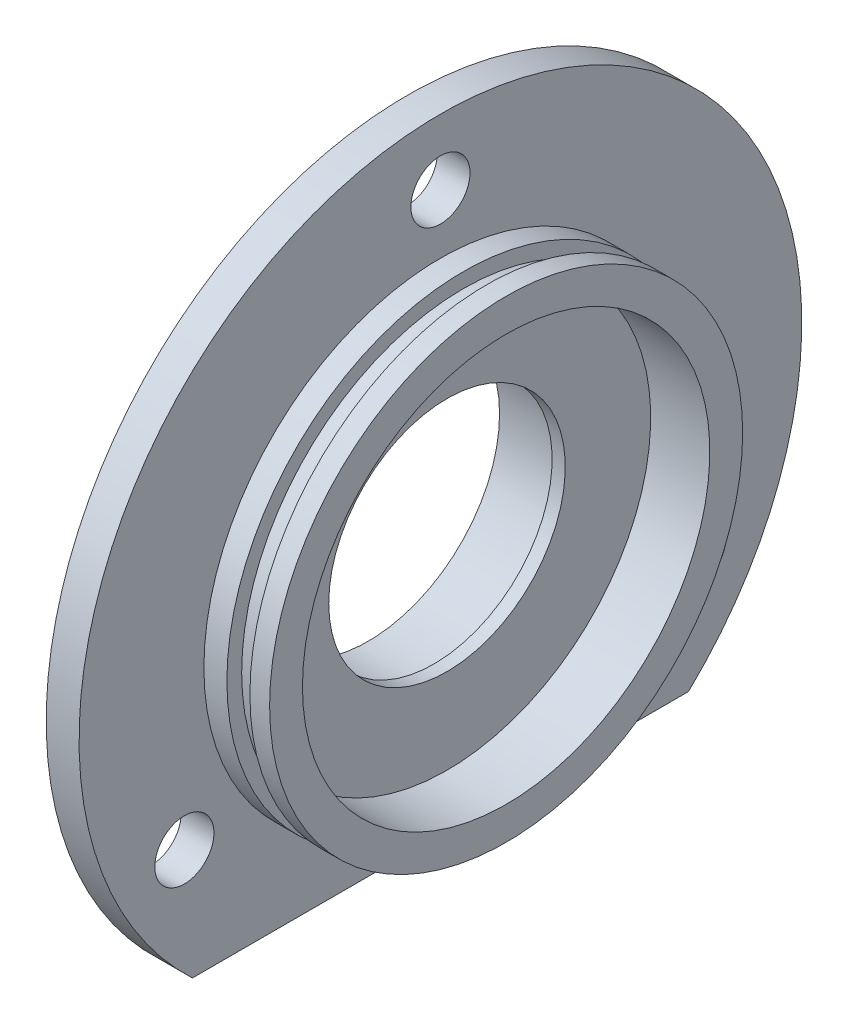
ISO-10303-21;
HEADER;
FILE_DESCRIPTION(('STEP AP214'),'2;1');
FILE_NAME('part.step','',(''),(''),'','','');
FILE_SCHEMA(('AUTOMOTIVE_DESIGN { 1 0 10303 214 1 1 1 1 }'));
ENDSEC;
DATA;
#1=APPLICATION_CONTEXT('core data for automotive mechanical design processes');
#2=APPLICATION_PROTOCOL_DEFINITION('international standard','automotive_design',2000,#1);
#3=PRODUCT_CONTEXT('',#1,'mechanical');
#4=PRODUCT('Part','Part','',(#3));
#5=PRODUCT_RELATED_PRODUCT_CATEGORY('part','',(#4));
#6=PRODUCT_DEFINITION_FORMATION('','',#4);
#7=PRODUCT_DEFINITION_CONTEXT('part definition',#1,'design');
#8=PRODUCT_DEFINITION('design','',#6,#7);
#9=PRODUCT_DEFINITION_SHAPE('','',#8);
#10=(LENGTH_UNIT() NAMED_UNIT(*) SI_UNIT(.MILLI.,.METRE.));
#11=(NAMED_UNIT(*) PLANE_ANGLE_UNIT() SI_UNIT($,.RADIAN.));
#12=(NAMED_UNIT(*) SI_UNIT($,.STERADIAN.) SOLID_ANGLE_UNIT());
#13=UNCERTAINTY_MEASURE_WITH_UNIT(LENGTH_MEASURE(1.E-05),#10,'distance_accuracy_value','');
#14=(GEOMETRIC_REPRESENTATION_CONTEXT(3) GLOBAL_UNCERTAINTY_ASSIGNED_CONTEXT((#13)) GLOBAL_UNIT_ASSIGNED_CONTEXT((#10,
#11,#12)) REPRESENTATION_CONTEXT('',''));
#15=CARTESIAN_POINT('',(0.,0.,0.));
#16=DIRECTION('',(0.,0.,1.));
#17=DIRECTION('',(1.,0.,0.));
#18=AXIS2_PLACEMENT_3D('',#15,#16,#17);
#19=CARTESIAN_POINT('',(-8.30675957445903,-20.,0.));
#20=DIRECTION('',(-1.,0.,0.));
#21=DIRECTION('',(0.,0.,1.));
#22=AXIS2_PLACEMENT_3D('',#19,#20,#21);
#23=CYLINDRICAL_SURFACE('',#22,25.);
#24=CARTESIAN_POINT('',(0.,-20.,0.));
#25=DIRECTION('',(-1.,0.,0.));
#26=DIRECTION('',(0.,0.,1.));
#27=AXIS2_PLACEMENT_3D('',#24,#25,#26);
#28=CIRCLE('',#27,25.);
#29=CARTESIAN_POINT('',(0.,-20.,25.));
#30=VERTEX_POINT('',#29);
#31=EDGE_CURVE('E11',#30,#30,#28,.T.);
#32=ORIENTED_EDGE('',*,*,#31,.F.);
#33=EDGE_LOOP('',(#32));
#34=FACE_BOUND('',#33,.T.);
#35=CARTESIAN_POINT('',(6.,-20.,0.));
#36=DIRECTION('',(-1.,0.,0.));
#37=DIRECTION('',(0.,0.,1.));
#38=AXIS2_PLACEMENT_3D('',#35,#36,#37);
#39=CIRCLE('',#38,25.);
#40=CARTESIAN_POINT('',(6.,-20.,25.));
#41=VERTEX_POINT('',#40);
#42=EDGE_CURVE('E84',#41,#41,#39,.T.);
#43=ORIENTED_EDGE('',*,*,#42,.T.);
#44=EDGE_LOOP('',(#43));
#45=FACE_BOUND('',#44,.T.);
#46=ADVANCED_FACE('F39',(#34,#45),#23,.T.);
#47=CARTESIAN_POINT('',(0.,0.,0.));
#48=DIRECTION('',(1.,0.,0.));
#49=DIRECTION('',(0.,0.,-1.));
#50=AXIS2_PLACEMENT_3D('',#47,#48,#49);
#51=PLANE('',#50);
#52=CARTESIAN_POINT('',(0.,-20.,0.));
#53=DIRECTION('',(-1.,0.,0.));
#54=DIRECTION('',(0.,0.,1.));
#55=AXIS2_PLACEMENT_3D('',#52,#53,#54);
#56=CIRCLE('',#55,20.);
#57=CARTESIAN_POINT('',(0.,-20.,20.));
#58=VERTEX_POINT('',#57);
#59=EDGE_CURVE('E48',#58,#58,#56,.T.);
#60=ORIENTED_EDGE('',*,*,#59,.F.);
#61=EDGE_LOOP('',(#60));
#62=FACE_BOUND('',#61,.T.);
#63=ORIENTED_EDGE('',*,*,#31,.T.);
#64=EDGE_LOOP('',(#63));
#65=FACE_BOUND('',#64,.T.);
#66=ADVANCED_FACE('F169',(#62,#65),#51,.F.);
#67=CARTESIAN_POINT('',(-8.30675957445903,-20.,0.));
#68=DIRECTION('',(-1.,0.,0.));
#69=DIRECTION('',(0.,0.,1.));
#70=AXIS2_PLACEMENT_3D('',#67,#68,#69);
#71=CYLINDRICAL_SURFACE('',#70,20.);
#72=CARTESIAN_POINT('',(10.,-20.,0.));
#73=DIRECTION('',(-1.,0.,0.));
#74=DIRECTION('',(0.,0.,1.));
#75=AXIS2_PLACEMENT_3D('',#72,#73,#74);
#76=CIRCLE('',#75,20.);
#77=CARTESIAN_POINT('',(10.,-20.,20.));
#78=VERTEX_POINT('',#77);
#79=EDGE_CURVE('E133',#78,#78,#76,.T.);
#80=ORIENTED_EDGE('',*,*,#79,.F.);
#81=EDGE_LOOP('',(#80));
#82=FACE_BOUND('',#81,.T.);
#83=ORIENTED_EDGE('',*,*,#59,.T.);
#84=EDGE_LOOP('',(#83));
#85=FACE_BOUND('',#84,.T.);
#86=ADVANCED_FACE('F174',(#82,#85),#71,.F.);
#87=CARTESIAN_POINT('',(10.,-2.00000000000001,0.));
#88=DIRECTION('',(1.,0.,0.));
#89=DIRECTION('',(0.,0.,-1.));
#90=AXIS2_PLACEMENT_3D('',#87,#88,#89);
#91=PLANE('',#90);
#92=CARTESIAN_POINT('',(10.,-20.,0.));
#93=DIRECTION('',(-1.,0.,0.));
#94=DIRECTION('',(0.,0.,1.));
#95=AXIS2_PLACEMENT_3D('',#92,#93,#94);
#96=CIRCLE('',#95,18.);
#97=CARTESIAN_POINT('',(10.,-20.,18.));
#98=VERTEX_POINT('',#97);
#99=EDGE_CURVE('E129',#98,#98,#96,.T.);
#100=ORIENTED_EDGE('',*,*,#99,.F.);
#101=EDGE_LOOP('',(#100));
#102=FACE_BOUND('',#101,.T.);
#103=ORIENTED_EDGE('',*,*,#79,.T.);
#104=EDGE_LOOP('',(#103));
#105=FACE_BOUND('',#104,.T.);
#106=ADVANCED_FACE('F229',(#102,#105),#91,.F.);
#107=CARTESIAN_POINT('',(-8.30675957445903,-20.,0.));
#108=DIRECTION('',(-1.,0.,0.));
#109=DIRECTION('',(0.,0.,1.));
#110=AXIS2_PLACEMENT_3D('',#107,#108,#109);
#111=CYLINDRICAL_SURFACE('',#110,18.);
#112=CARTESIAN_POINT('',(12.,-20.,0.));
#113=DIRECTION('',(-1.,0.,0.));
#114=DIRECTION('',(0.,0.,1.));
#115=AXIS2_PLACEMENT_3D('',#112,#113,#114);
#116=CIRCLE('',#115,18.);
#117=CARTESIAN_POINT('',(12.,-20.,18.));
#118=VERTEX_POINT('',#117);
#119=EDGE_CURVE('E125',#118,#118,#116,.T.);
#120=ORIENTED_EDGE('',*,*,#119,.F.);
#121=EDGE_LOOP('',(#120));
#122=FACE_BOUND('',#121,.T.);
#123=ORIENTED_EDGE('',*,*,#99,.T.);
#124=EDGE_LOOP('',(#123));
#125=FACE_BOUND('',#124,.T.);
#126=ADVANCED_FACE('F225',(#122,#125),#111,.F.);
#127=CARTESIAN_POINT('',(12.,11.,0.));
#128=DIRECTION('',(-1.,0.,0.));
#129=DIRECTION('',(0.,0.,1.));
#130=AXIS2_PLACEMENT_3D('',#127,#128,#129);
#131=PLANE('',#130);
#132=CARTESIAN_POINT('',(12.,-20.,0.));
#133=DIRECTION('',(-1.,0.,0.));
#134=DIRECTION('',(0.,0.,1.));
#135=AXIS2_PLACEMENT_3D('',#132,#133,#134);
#136=CIRCLE('',#135,31.);
#137=CARTESIAN_POINT('',(12.,-20.,31.));
#138=VERTEX_POINT('',#137);
#139=EDGE_CURVE('E121',#138,#138,#136,.T.);
#140=ORIENTED_EDGE('',*,*,#139,.F.);
#141=EDGE_LOOP('',(#140));
#142=FACE_BOUND('',#141,.T.);
#143=ORIENTED_EDGE('',*,*,#119,.T.);
#144=EDGE_LOOP('',(#143));
#145=FACE_BOUND('',#144,.T.);
#146=ADVANCED_FACE('F221',(#142,#145),#131,.F.);
#147=CARTESIAN_POINT('',(-8.30675957445903,-20.,0.));
#148=DIRECTION('',(-1.,0.,0.));
#149=DIRECTION('',(0.,0.,1.));
#150=AXIS2_PLACEMENT_3D('',#147,#148,#149);
#151=CYLINDRICAL_SURFACE('',#150,31.);
#152=CARTESIAN_POINT('',(21.,-20.,0.));
#153=DIRECTION('',(-1.,0.,0.));
#154=DIRECTION('',(0.,0.,1.));
#155=AXIS2_PLACEMENT_3D('',#152,#153,#154);
#156=CIRCLE('',#155,31.);
#157=CARTESIAN_POINT('',(21.,-20.,31.));
#158=VERTEX_POINT('',#157);
#159=EDGE_CURVE('E117',#158,#158,#156,.T.);
#160=ORIENTED_EDGE('',*,*,#159,.F.);
#161=EDGE_LOOP('',(#160));
#162=FACE_BOUND('',#161,.T.);
#163=ORIENTED_EDGE('',*,*,#139,.T.);
#164=EDGE_LOOP('',(#163));
#165=FACE_BOUND('',#164,.T.);
#166=ADVANCED_FACE('F217',(#162,#165),#151,.F.);
#167=CARTESIAN_POINT('',(21.,16.,0.));
#168=DIRECTION('',(-1.,0.,0.));
#169=DIRECTION('',(0.,0.,1.));
#170=AXIS2_PLACEMENT_3D('',#167,#168,#169);
#171=PLANE('',#170);
#172=CARTESIAN_POINT('',(21.,-20.,0.));
#173=DIRECTION('',(-1.,0.,0.));
#174=DIRECTION('',(0.,0.,1.));
#175=AXIS2_PLACEMENT_3D('',#172,#173,#174);
#176=CIRCLE('',#175,36.);
#177=CARTESIAN_POINT('',(21.,-20.,36.));
#178=VERTEX_POINT('',#177);
#179=EDGE_CURVE('E113',#178,#178,#176,.T.);
#180=ORIENTED_EDGE('',*,*,#179,.F.);
#181=EDGE_LOOP('',(#180));
#182=FACE_BOUND('',#181,.T.);
#183=ORIENTED_EDGE('',*,*,#159,.T.);
#184=EDGE_LOOP('',(#183));
#185=FACE_BOUND('',#184,.T.);
#186=ADVANCED_FACE('F213',(#182,#185),#171,.F.);
#187=CARTESIAN_POINT('',(-8.30675957445903,-20.,0.));
#188=DIRECTION('',(-1.,0.,0.));
#189=DIRECTION('',(0.,0.,1.));
#190=AXIS2_PLACEMENT_3D('',#187,#188,#189);
#191=CYLINDRICAL_SURFACE('',#190,36.);
#192=CARTESIAN_POINT('',(18.,-20.,0.));
#193=DIRECTION('',(-1.,0.,0.));
#194=DIRECTION('',(0.,0.,1.));
#195=AXIS2_PLACEMENT_3D('',#192,#193,#194);
#196=CIRCLE('',#195,36.);
#197=CARTESIAN_POINT('',(18.,-20.,36.));
#198=VERTEX_POINT('',#197);
#199=EDGE_CURVE('E109',#198,#198,#196,.T.);
#200=ORIENTED_EDGE('',*,*,#199,.F.);
#201=EDGE_LOOP('',(#200));
#202=FACE_BOUND('',#201,.T.);
#203=ORIENTED_EDGE('',*,*,#179,.T.);
#204=EDGE_LOOP('',(#203));
#205=FACE_BOUND('',#204,.T.);
#206=ADVANCED_FACE('F209',(#202,#205),#191,.T.);
#207=CARTESIAN_POINT('',(18.,13.75,0.));
#208=DIRECTION('',(1.,0.,0.));
#209=DIRECTION('',(0.,0.,-1.));
#210=AXIS2_PLACEMENT_3D('',#207,#208,#209);
#211=PLANE('',#210);
#212=CARTESIAN_POINT('',(18.,-20.,0.));
#213=DIRECTION('',(-1.,0.,0.));
#214=DIRECTION('',(0.,0.,1.));
#215=AXIS2_PLACEMENT_3D('',#212,#213,#214);
#216=CIRCLE('',#215,33.75);
#217=CARTESIAN_POINT('',(18.,-20.,33.75));
#218=VERTEX_POINT('',#217);
#219=EDGE_CURVE('E105',#218,#218,#216,.T.);
#220=ORIENTED_EDGE('',*,*,#219,.F.);
#221=EDGE_LOOP('',(#220));
#222=FACE_BOUND('',#221,.T.);
#223=ORIENTED_EDGE('',*,*,#199,.T.);
#224=EDGE_LOOP('',(#223));
#225=FACE_BOUND('',#224,.T.);
#226=ADVANCED_FACE('F205',(#222,#225),#211,.F.);
#227=CARTESIAN_POINT('',(-8.30675957445903,-20.,0.));
#228=DIRECTION('',(-1.,0.,0.));
#229=DIRECTION('',(0.,0.,1.));
#230=AXIS2_PLACEMENT_3D('',#227,#228,#229);
#231=CYLINDRICAL_SURFACE('',#230,33.75);
#232=CARTESIAN_POINT('',(14.5,-20.,0.));
#233=DIRECTION('',(-1.,0.,0.));
#234=DIRECTION('',(0.,0.,1.));
#235=AXIS2_PLACEMENT_3D('',#232,#233,#234);
#236=CIRCLE('',#235,33.75);
#237=CARTESIAN_POINT('',(14.5,-20.,33.75));
#238=VERTEX_POINT('',#237);
#239=EDGE_CURVE('E101',#238,#238,#236,.T.);
#240=ORIENTED_EDGE('',*,*,#239,.F.);
#241=EDGE_LOOP('',(#240));
#242=FACE_BOUND('',#241,.T.);
#243=ORIENTED_EDGE('',*,*,#219,.T.);
#244=EDGE_LOOP('',(#243));
#245=FACE_BOUND('',#244,.T.);
#246=ADVANCED_FACE('F201',(#242,#245),#231,.T.);
#247=CARTESIAN_POINT('',(14.5,16.,0.));
#248=DIRECTION('',(-1.,0.,0.));
#249=DIRECTION('',(0.,0.,1.));
#250=AXIS2_PLACEMENT_3D('',#247,#248,#249);
#251=PLANE('',#250);
#252=CARTESIAN_POINT('',(14.5,-20.,0.));
#253=DIRECTION('',(-1.,0.,0.));
#254=DIRECTION('',(0.,0.,1.));
#255=AXIS2_PLACEMENT_3D('',#252,#253,#254);
#256=CIRCLE('',#255,36.);
#257=CARTESIAN_POINT('',(14.5,-20.,36.));
#258=VERTEX_POINT('',#257);
#259=EDGE_CURVE('E97',#258,#258,#256,.T.);
#260=ORIENTED_EDGE('',*,*,#259,.F.);
#261=EDGE_LOOP('',(#260));
#262=FACE_BOUND('',#261,.T.);
#263=ORIENTED_EDGE('',*,*,#239,.T.);
#264=EDGE_LOOP('',(#263));
#265=FACE_BOUND('',#264,.T.);
#266=ADVANCED_FACE('F197',(#262,#265),#251,.F.);
#267=CARTESIAN_POINT('',(-8.30675957445903,-20.,0.));
#268=DIRECTION('',(-1.,0.,0.));
#269=DIRECTION('',(0.,0.,1.));
#270=AXIS2_PLACEMENT_3D('',#267,#268,#269);
#271=CYLINDRICAL_SURFACE('',#270,36.);
#272=CARTESIAN_POINT('',(11.,-20.,0.));
#273=DIRECTION('',(-1.,0.,0.));
#274=DIRECTION('',(0.,0.,1.));
#275=AXIS2_PLACEMENT_3D('',#272,#273,#274);
#276=CIRCLE('',#275,36.);
#277=CARTESIAN_POINT('',(11.,-20.,36.));
#278=VERTEX_POINT('',#277);
#279=EDGE_CURVE('E88',#278,#278,#276,.T.);
#280=ORIENTED_EDGE('',*,*,#279,.F.);
#281=EDGE_LOOP('',(#280));
#282=FACE_BOUND('',#281,.T.);
#283=ORIENTED_EDGE('',*,*,#259,.T.);
#284=EDGE_LOOP('',(#283));
#285=FACE_BOUND('',#284,.T.);
#286=ADVANCED_FACE('F193',(#282,#285),#271,.T.);
#287=CARTESIAN_POINT('',(11.,35.,0.));
#288=DIRECTION('',(-1.,0.,0.));
#289=DIRECTION('',(0.,0.,1.));
#290=AXIS2_PLACEMENT_3D('',#287,#288,#289);
#291=PLANE('',#290);
#292=CARTESIAN_POINT('',(11.,25.,0.));
#293=DIRECTION('',(1.,0.,0.));
#294=DIRECTION('',(0.,0.,-1.));
#295=AXIS2_PLACEMENT_3D('',#292,#293,#294);
#296=CIRCLE('',#295,4.5);
#297=CARTESIAN_POINT('',(11.,25.,-4.49999999999999));
#298=VERTEX_POINT('',#297);
#299=EDGE_CURVE('E144',#298,#298,#296,.T.);
#300=ORIENTED_EDGE('',*,*,#299,.F.);
#301=EDGE_LOOP('',(#300));
#302=FACE_BOUND('',#301,.T.);
#303=CARTESIAN_POINT('',(11.,-42.5,-38.9711431702997));
#304=DIRECTION('',(1.,0.,0.));
#305=DIRECTION('',(0.,0.,-1.));
#306=AXIS2_PLACEMENT_3D('',#303,#304,#305);
#307=CIRCLE('',#306,4.5);
#308=CARTESIAN_POINT('',(11.,-42.5,-43.4711431702997));
#309=VERTEX_POINT('',#308);
#310=EDGE_CURVE('E380',#309,#309,#307,.T.);
#311=ORIENTED_EDGE('',*,*,#310,.F.);
#312=EDGE_LOOP('',(#311));
#313=FACE_BOUND('',#312,.T.);
#314=CARTESIAN_POINT('',(11.,-42.5,38.9711431702997));
#315=DIRECTION('',(1.,0.,0.));
#316=DIRECTION('',(0.,0.,-1.));
#317=AXIS2_PLACEMENT_3D('',#314,#315,#316);
#318=CIRCLE('',#317,4.50000000000001);
#319=CARTESIAN_POINT('',(11.,-42.5,34.4711431702997));
#320=VERTEX_POINT('',#319);
#321=EDGE_CURVE('E384',#320,#320,#318,.T.);
#322=ORIENTED_EDGE('',*,*,#321,.F.);
#323=EDGE_LOOP('',(#322));
#324=FACE_BOUND('',#323,.T.);
#325=CARTESIAN_POINT('',(11.,-20.,0.));
#326=DIRECTION('',(-1.,0.,0.));
#327=DIRECTION('',(0.,0.,1.));
#328=AXIS2_PLACEMENT_3D('',#325,#326,#327);
#329=CIRCLE('',#328,55.);
#330=CARTESIAN_POINT('',(11.,-60.,37.7491721763537));
#331=VERTEX_POINT('',#330);
#332=CARTESIAN_POINT('',(11.,-60.,-37.7491721763537));
#333=VERTEX_POINT('',#332);
#334=EDGE_CURVE('E78',#331,#333,#329,.T.);
#335=ORIENTED_EDGE('',*,*,#334,.F.);
#336=DIRECTION('',(0.,0.,-1.));
#337=VECTOR('',#336,1.);
#338=CARTESIAN_POINT('',(11.,-60.,0.));
#339=LINE('',#338,#337);
#340=EDGE_CURVE('E80',#331,#333,#339,.T.);
#341=ORIENTED_EDGE('',*,*,#340,.T.);
#342=EDGE_LOOP('',(#335,#341));
#343=FACE_BOUND('',#342,.T.);
#344=ORIENTED_EDGE('',*,*,#279,.T.);
#345=EDGE_LOOP('',(#344));
#346=FACE_BOUND('',#345,.T.);
#347=ADVANCED_FACE('F188',(#302,#313,#324,#343,#346),#291,.F.);
#348=CARTESIAN_POINT('',(-8.30675957445903,-20.,0.));
#349=DIRECTION('',(-1.,0.,0.));
#350=DIRECTION('',(0.,0.,1.));
#351=AXIS2_PLACEMENT_3D('',#348,#349,#350);
#352=CYLINDRICAL_SURFACE('',#351,55.);
#353=ORIENTED_EDGE('',*,*,#334,.T.);
#354=DIRECTION('',(-1.,0.,0.));
#355=VECTOR('',#354,1.);
#356=CARTESIAN_POINT('',(21.,-60.,-37.7491721763537));
#357=LINE('',#356,#355);
#358=CARTESIAN_POINT('',(6.,-60.,-37.7491721763537));
#359=VERTEX_POINT('',#358);
#360=EDGE_CURVE('E61',#333,#359,#357,.T.);
#361=ORIENTED_EDGE('',*,*,#360,.T.);
#362=CARTESIAN_POINT('',(6.,-20.,0.));
#363=DIRECTION('',(-1.,0.,0.));
#364=DIRECTION('',(0.,0.,1.));
#365=AXIS2_PLACEMENT_3D('',#362,#363,#364);
#366=CIRCLE('',#365,55.);
#367=CARTESIAN_POINT('',(6.,-60.,37.7491721763537));
#368=VERTEX_POINT('',#367);
#369=EDGE_CURVE('E76',#368,#359,#366,.T.);
#370=ORIENTED_EDGE('',*,*,#369,.F.);
#371=DIRECTION('',(-1.,0.,0.));
#372=VECTOR('',#371,1.);
#373=CARTESIAN_POINT('',(21.,-60.,37.7491721763537));
#374=LINE('',#373,#372);
#375=EDGE_CURVE('E56',#331,#368,#374,.T.);
#376=ORIENTED_EDGE('',*,*,#375,.F.);
#377=EDGE_LOOP('',(#353,#361,#370,#376));
#378=FACE_BOUND('',#377,.T.);
#379=ADVANCED_FACE('F75',(#378),#352,.T.);
#380=CARTESIAN_POINT('',(6.,5.,0.));
#381=DIRECTION('',(1.,0.,0.));
#382=DIRECTION('',(0.,0.,-1.));
#383=AXIS2_PLACEMENT_3D('',#380,#381,#382);
#384=PLANE('',#383);
#385=CARTESIAN_POINT('',(6.,25.,0.));
#386=DIRECTION('',(1.,0.,0.));
#387=DIRECTION('',(0.,0.,-1.));
#388=AXIS2_PLACEMENT_3D('',#385,#386,#387);
#389=CIRCLE('',#388,4.5);
#390=CARTESIAN_POINT('',(6.,25.,-4.49999999999999));
#391=VERTEX_POINT('',#390);
#392=EDGE_CURVE('E42',#391,#391,#389,.T.);
#393=ORIENTED_EDGE('',*,*,#392,.T.);
#394=EDGE_LOOP('',(#393));
#395=FACE_BOUND('',#394,.T.);
#396=CARTESIAN_POINT('',(6.,-42.5,-38.9711431702997));
#397=DIRECTION('',(1.,0.,0.));
#398=DIRECTION('',(0.,0.,-1.));
#399=AXIS2_PLACEMENT_3D('',#396,#397,#398);
#400=CIRCLE('',#399,4.5);
#401=CARTESIAN_POINT('',(6.,-42.5,-43.4711431702997));
#402=VERTEX_POINT('',#401);
#403=EDGE_CURVE('E143',#402,#402,#400,.T.);
#404=ORIENTED_EDGE('',*,*,#403,.T.);
#405=EDGE_LOOP('',(#404));
#406=FACE_BOUND('',#405,.T.);
#407=CARTESIAN_POINT('',(6.,-42.5,38.9711431702997));
#408=DIRECTION('',(1.,0.,0.));
#409=DIRECTION('',(0.,0.,-1.));
#410=AXIS2_PLACEMENT_3D('',#407,#408,#409);
#411=CIRCLE('',#410,4.50000000000001);
#412=CARTESIAN_POINT('',(6.,-42.5,34.4711431702997));
#413=VERTEX_POINT('',#412);
#414=EDGE_CURVE('E140',#413,#413,#411,.T.);
#415=ORIENTED_EDGE('',*,*,#414,.T.);
#416=EDGE_LOOP('',(#415));
#417=FACE_BOUND('',#416,.T.);
#418=ORIENTED_EDGE('',*,*,#42,.F.);
#419=EDGE_LOOP('',(#418));
#420=FACE_BOUND('',#419,.T.);
#421=ORIENTED_EDGE('',*,*,#369,.T.);
#422=DIRECTION('',(0.,0.,-1.));
#423=VECTOR('',#422,1.);
#424=CARTESIAN_POINT('',(6.,-60.,-37.7491721763537));
#425=LINE('',#424,#423);
#426=EDGE_CURVE('E66',#368,#359,#425,.T.);
#427=ORIENTED_EDGE('',*,*,#426,.F.);
#428=EDGE_LOOP('',(#421,#427));
#429=FACE_BOUND('',#428,.T.);
#430=ADVANCED_FACE('F82',(#395,#406,#417,#420,#429),#384,.F.);
#431=CARTESIAN_POINT('',(0.,-42.5,38.9711431702997));
#432=DIRECTION('',(1.,0.,0.));
#433=DIRECTION('',(0.,0.,-1.));
#434=AXIS2_PLACEMENT_3D('',#431,#432,#433);
#435=CYLINDRICAL_SURFACE('',#434,4.50000000000001);
#436=ORIENTED_EDGE('',*,*,#321,.T.);
#437=EDGE_LOOP('',(#436));
#438=FACE_BOUND('',#437,.T.);
#439=ORIENTED_EDGE('',*,*,#414,.F.);
#440=EDGE_LOOP('',(#439));
#441=FACE_BOUND('',#440,.T.);
#442=ADVANCED_FACE('F164',(#438,#441),#435,.F.);
#443=CARTESIAN_POINT('',(0.,-42.5,-38.9711431702997));
#444=DIRECTION('',(1.,0.,0.));
#445=DIRECTION('',(0.,0.,-1.));
#446=AXIS2_PLACEMENT_3D('',#443,#444,#445);
#447=CYLINDRICAL_SURFACE('',#446,4.5);
#448=ORIENTED_EDGE('',*,*,#310,.T.);
#449=EDGE_LOOP('',(#448));
#450=FACE_BOUND('',#449,.T.);
#451=ORIENTED_EDGE('',*,*,#403,.F.);
#452=EDGE_LOOP('',(#451));
#453=FACE_BOUND('',#452,.T.);
#454=ADVANCED_FACE('F156',(#450,#453),#447,.F.);
#455=CARTESIAN_POINT('',(0.,25.,0.));
#456=DIRECTION('',(1.,0.,0.));
#457=DIRECTION('',(0.,0.,-1.));
#458=AXIS2_PLACEMENT_3D('',#455,#456,#457);
#459=CYLINDRICAL_SURFACE('',#458,4.5);
#460=ORIENTED_EDGE('',*,*,#299,.T.);
#461=EDGE_LOOP('',(#460));
#462=FACE_BOUND('',#461,.T.);
#463=ORIENTED_EDGE('',*,*,#392,.F.);
#464=EDGE_LOOP('',(#463));
#465=FACE_BOUND('',#464,.T.);
#466=ADVANCED_FACE('F154',(#462,#465),#459,.F.);
#467=CARTESIAN_POINT('',(21.,-60.,-37.7491721763537));
#468=DIRECTION('',(0.,1.,0.));
#469=DIRECTION('',(0.,0.,1.));
#470=AXIS2_PLACEMENT_3D('',#467,#468,#469);
#471=PLANE('',#470);
#472=ORIENTED_EDGE('',*,*,#375,.T.);
#473=ORIENTED_EDGE('',*,*,#426,.T.);
#474=ORIENTED_EDGE('',*,*,#360,.F.);
#475=ORIENTED_EDGE('',*,*,#340,.F.);
#476=EDGE_LOOP('',(#472,#473,#474,#475));
#477=FACE_BOUND('',#476,.T.);
#478=ADVANCED_FACE('F67',(#477),#471,.F.);
#479=CLOSED_SHELL('',(#46,#66,#86,#106,#126,#146,#166,#186,#206,#226,#246,#266,#286,#347,#379,
#430,#442,#454,#466,#478));
#480=MANIFOLD_SOLID_BREP('B2',#479);
#481=ADVANCED_BREP_SHAPE_REPRESENTATION('',(#18,#480),#14);
#482=SHAPE_DEFINITION_REPRESENTATION(#9,#481);
ENDSEC;
END-ISO-10303-21;
